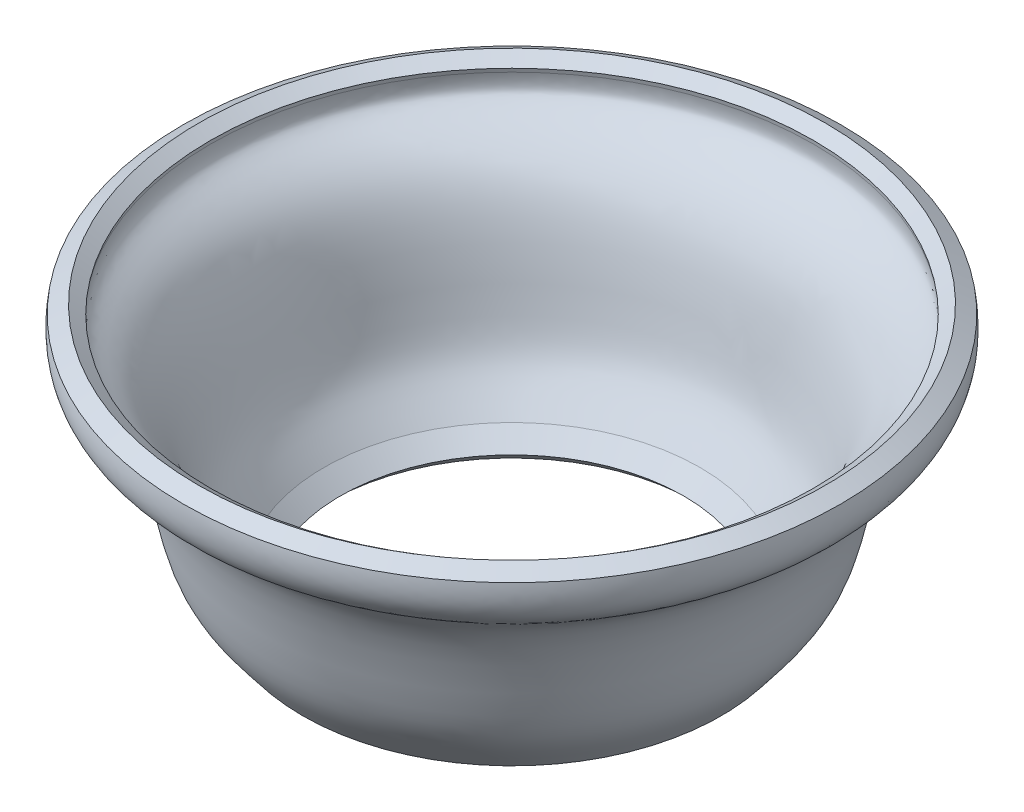
ISO-10303-21;
HEADER;
FILE_DESCRIPTION(('STEP AP214'),'2;1');
FILE_NAME('part.step','',(''),(''),'','','');
FILE_SCHEMA(('AUTOMOTIVE_DESIGN { 1 0 10303 214 1 1 1 1 }'));
ENDSEC;
DATA;
#1=APPLICATION_CONTEXT('core data for automotive mechanical design processes');
#2=APPLICATION_PROTOCOL_DEFINITION('international standard','automotive_design',2000,#1);
#3=PRODUCT_CONTEXT('',#1,'mechanical');
#4=PRODUCT('Part','Part','',(#3));
#5=PRODUCT_RELATED_PRODUCT_CATEGORY('part','',(#4));
#6=PRODUCT_DEFINITION_FORMATION('','',#4);
#7=PRODUCT_DEFINITION_CONTEXT('part definition',#1,'design');
#8=PRODUCT_DEFINITION('design','',#6,#7);
#9=PRODUCT_DEFINITION_SHAPE('','',#8);
#10=(LENGTH_UNIT() NAMED_UNIT(*) SI_UNIT(.MILLI.,.METRE.));
#11=(NAMED_UNIT(*) PLANE_ANGLE_UNIT() SI_UNIT($,.RADIAN.));
#12=(NAMED_UNIT(*) SI_UNIT($,.STERADIAN.) SOLID_ANGLE_UNIT());
#13=UNCERTAINTY_MEASURE_WITH_UNIT(LENGTH_MEASURE(1.E-05),#10,'distance_accuracy_value','');
#14=(GEOMETRIC_REPRESENTATION_CONTEXT(3) GLOBAL_UNCERTAINTY_ASSIGNED_CONTEXT((#13)) GLOBAL_UNIT_ASSIGNED_CONTEXT((#10,
#11,#12)) REPRESENTATION_CONTEXT('',''));
#15=CARTESIAN_POINT('',(0.,0.,0.));
#16=DIRECTION('',(0.,0.,1.));
#17=DIRECTION('',(1.,0.,0.));
#18=AXIS2_PLACEMENT_3D('',#15,#16,#17);
#19=CARTESIAN_POINT('',(77.9221141876927,25.4483814253624,0.));
#20=CARTESIAN_POINT('',(87.3940894819513,37.7299819321549,0.));
#21=CARTESIAN_POINT('',(92.1339969895028,41.8945842622561,0.));
#22=CARTESIAN_POINT('',(101.743341333837,99.7624551130541,0.));
#23=CARTESIAN_POINT('',(125.04695061557,97.4464920107877,0.));
#24=CARTESIAN_POINT('',(122.348179271715,115.917975982715,0.));
#25=B_SPLINE_CURVE_WITH_KNOTS('',3,(#19,#20,#21,#22,#23,#24),.UNSPECIFIED.,.F.,.F.,(4,1,1,4),
(0.,0.405601663420496,0.656925898222149,1.),.UNSPECIFIED.);
#26=CARTESIAN_POINT('',(0.,0.,0.));
#27=DIRECTION('',(0.,-1.,0.));
#28=AXIS1_PLACEMENT('',#26,#27);
#29=SURFACE_OF_REVOLUTION('',#25,#28);
#30=CARTESIAN_POINT('',(0.,115.917975982715,0.));
#31=DIRECTION('',(0.,-1.,0.));
#32=DIRECTION('',(0.,0.,-1.));
#33=AXIS2_PLACEMENT_3D('',#30,#31,#32);
#34=CIRCLE('',#33,122.348179271715);
#35=CARTESIAN_POINT('',(0.,115.917975982715,-122.348179271715));
#36=VERTEX_POINT('',#35);
#37=EDGE_CURVE('E10',#36,#36,#34,.T.);
#38=ORIENTED_EDGE('',*,*,#37,.T.);
#39=EDGE_LOOP('',(#38));
#40=FACE_BOUND('',#39,.T.);
#41=CARTESIAN_POINT('',(0.,25.4483814253624,0.));
#42=DIRECTION('',(0.,-1.,0.));
#43=DIRECTION('',(0.,0.,-1.));
#44=AXIS2_PLACEMENT_3D('',#41,#42,#43);
#45=CIRCLE('',#44,77.9221141876927);
#46=CARTESIAN_POINT('',(0.,25.4483814253624,-77.9221141876927));
#47=VERTEX_POINT('',#46);
#48=EDGE_CURVE('E75',#47,#47,#45,.T.);
#49=ORIENTED_EDGE('',*,*,#48,.F.);
#50=EDGE_LOOP('',(#49));
#51=FACE_BOUND('',#50,.T.);
#52=ADVANCED_FACE('F39',(#40,#51),#29,.F.);
#53=CARTESIAN_POINT('',(0.,115.917975982715,0.));
#54=DIRECTION('',(0.,-1.,0.));
#55=DIRECTION('',(0.,0.,-1.));
#56=AXIS2_PLACEMENT_3D('',#53,#54,#55);
#57=CONICAL_SURFACE('',#56,122.348179271715,1.04341288411621);
#58=CARTESIAN_POINT('',(0.,119.187259384567,0.));
#59=DIRECTION('',(0.,-1.,0.));
#60=DIRECTION('',(0.,0.,-1.));
#61=AXIS2_PLACEMENT_3D('',#58,#59,#60);
#62=CIRCLE('',#61,116.734784822938);
#63=CARTESIAN_POINT('',(0.,119.187259384567,-116.734784822938));
#64=VERTEX_POINT('',#63);
#65=EDGE_CURVE('E47',#64,#64,#62,.T.);
#66=ORIENTED_EDGE('',*,*,#65,.T.);
#67=EDGE_LOOP('',(#66));
#68=FACE_BOUND('',#67,.T.);
#69=ORIENTED_EDGE('',*,*,#37,.F.);
#70=EDGE_LOOP('',(#69));
#71=FACE_BOUND('',#70,.T.);
#72=ADVANCED_FACE('F102',(#68,#71),#57,.T.);
#73=CARTESIAN_POINT('',(0.,119.187259384567,0.));
#74=DIRECTION('',(0.,1.,0.));
#75=DIRECTION('',(0.,0.,1.));
#76=AXIS2_PLACEMENT_3D('',#73,#74,#75);
#77=CONICAL_SURFACE('',#76,116.734784822938,0.945821529777048);
#78=CARTESIAN_POINT('',(0.,115.917975982715,0.));
#79=DIRECTION('',(0.,-1.,0.));
#80=DIRECTION('',(0.,0.,-1.));
#81=AXIS2_PLACEMENT_3D('',#78,#79,#80);
#82=CIRCLE('',#81,112.203215086463);
#83=CARTESIAN_POINT('',(0.,115.917975982715,-112.203215086463));
#84=VERTEX_POINT('',#83);
#85=EDGE_CURVE('E52',#84,#84,#82,.T.);
#86=ORIENTED_EDGE('',*,*,#85,.T.);
#87=EDGE_LOOP('',(#86));
#88=FACE_BOUND('',#87,.T.);
#89=ORIENTED_EDGE('',*,*,#65,.F.);
#90=EDGE_LOOP('',(#89));
#91=FACE_BOUND('',#90,.T.);
#92=ADVANCED_FACE('F99',(#88,#91),#77,.F.);
#93=CARTESIAN_POINT('',(0.,115.917975982715,0.));
#94=DIRECTION('',(0.,-1.,0.));
#95=DIRECTION('',(0.,0.,-1.));
#96=AXIS2_PLACEMENT_3D('',#93,#94,#95);
#97=CONICAL_SURFACE('',#96,112.203215086463,0.171245586011219);
#98=CARTESIAN_POINT('',(0.,114.47227748403,0.));
#99=DIRECTION('',(0.,-1.,0.));
#100=DIRECTION('',(0.,0.,-1.));
#101=AXIS2_PLACEMENT_3D('',#98,#99,#100);
#102=CIRCLE('',#101,112.453233296577);
#103=CARTESIAN_POINT('',(0.,114.47227748403,-112.453233296577));
#104=VERTEX_POINT('',#103);
#105=EDGE_CURVE('E57',#104,#104,#102,.T.);
#106=ORIENTED_EDGE('',*,*,#105,.T.);
#107=EDGE_LOOP('',(#106));
#108=FACE_BOUND('',#107,.T.);
#109=ORIENTED_EDGE('',*,*,#85,.F.);
#110=EDGE_LOOP('',(#109));
#111=FACE_BOUND('',#110,.T.);
#112=ADVANCED_FACE('F94',(#108,#111),#97,.F.);
#113=CARTESIAN_POINT('',(112.453233296577,114.47227748403,0.));
#114=CARTESIAN_POINT('',(112.497046512243,114.172402093408,0.));
#115=CARTESIAN_POINT('',(112.577768508592,113.54932973421,0.));
#116=CARTESIAN_POINT('',(112.678172061883,112.473726316707,0.));
#117=CARTESIAN_POINT('',(112.717650257948,111.323879625534,0.));
#118=CARTESIAN_POINT('',(112.661531964546,110.276388939014,0.));
#119=CARTESIAN_POINT('',(112.505121694198,109.262598865516,0.));
#120=CARTESIAN_POINT('',(112.263921299084,108.590233313085,0.));
#121=CARTESIAN_POINT('',(111.959441744317,108.064826198113,0.));
#122=CARTESIAN_POINT('',(111.289429579775,107.288159566067,0.));
#123=CARTESIAN_POINT('',(109.949238506969,106.157684220077,0.));
#124=CARTESIAN_POINT('',(107.901118573501,104.703722943208,0.));
#125=CARTESIAN_POINT('',(105.25177637214,102.882515679422,0.));
#126=CARTESIAN_POINT('',(102.167669155592,100.558410453743,0.));
#127=CARTESIAN_POINT('',(99.4185016618685,98.0384699963057,0.));
#128=CARTESIAN_POINT('',(97.2702097147581,95.6048269092689,0.));
#129=CARTESIAN_POINT('',(95.7097800265984,93.5355684130829,0.));
#130=CARTESIAN_POINT('',(94.3135368474947,91.3317697875323,0.));
#131=CARTESIAN_POINT('',(92.6911627646633,88.3458202726958,0.));
#132=CARTESIAN_POINT('',(90.9981240052986,84.4975556270147,0.));
#133=CARTESIAN_POINT('',(88.7957487403077,78.2035378026221,0.));
#134=CARTESIAN_POINT('',(87.1404446909139,71.8429060253683,0.));
#135=CARTESIAN_POINT('',(85.7951148545497,65.8464575934233,0.));
#136=CARTESIAN_POINT('',(84.9036513113898,61.6625519374478,0.));
#137=CARTESIAN_POINT('',(84.1027455017783,57.968162818229,0.));
#138=CARTESIAN_POINT('',(83.1127765862658,53.8426383977567,0.));
#139=CARTESIAN_POINT('',(81.9429813560959,49.846759754146,0.));
#140=CARTESIAN_POINT('',(80.5958406584344,46.4828266651874,0.));
#141=CARTESIAN_POINT('',(79.3620539644298,44.1882944387591,0.));
#142=CARTESIAN_POINT('',(78.0985803432021,42.2192740530324,0.));
#143=CARTESIAN_POINT('',(76.9619583054438,40.5986696771371,0.));
#144=CARTESIAN_POINT('',(75.6021133375992,38.7727422091658,0.));
#145=CARTESIAN_POINT('',(74.002744681414,36.6975557321779,0.));
#146=CARTESIAN_POINT('',(72.4568713068047,34.7169187483684,0.));
#147=CARTESIAN_POINT('',(71.1044190779229,32.9791646262186,0.));
#148=CARTESIAN_POINT('',(70.364419911247,32.0233674419788,0.));
#149=CARTESIAN_POINT('',(70.0035426336066,31.5554449212513,0.));
#150=B_SPLINE_CURVE_WITH_KNOTS('',3,(#113,#114,#115,#116,#117,#118,#119,#120,#121,#122,#123,
#124,#125,#126,#127,#128,#129,#130,#131,#132,#133,#134,#135,#136,#137,#138,#139,#140,#141,#142,
#143,#144,#145,#146,#147,#148,#149),.UNSPECIFIED.,.F.,.F.,(4,1,1,1,1,1,1,1,1,1,1,1,1,1,1,1,1,1,
1,1,1,1,1,1,1,1,1,1,1,1,1,1,1,1,4),(0.,0.0078125,0.015625,0.03125,0.046875,0.0625,0.09375,0.125,
0.15625,0.1875,0.21875,0.25,0.28125,0.3125,0.328125,0.34375,0.359375,0.375,0.40625,0.4375,0.5,
0.53125,0.5625,0.59375,0.625,0.6875,0.75,0.8125,0.84375,0.875,0.90625,0.9375,0.96875,0.984375,
1.),.UNSPECIFIED.);
#151=CARTESIAN_POINT('',(0.,0.,0.));
#152=DIRECTION('',(0.,-1.,0.));
#153=AXIS1_PLACEMENT('',#151,#152);
#154=SURFACE_OF_REVOLUTION('',#150,#153);
#155=CARTESIAN_POINT('',(0.,31.5554449212513,0.));
#156=DIRECTION('',(0.,-1.,0.));
#157=DIRECTION('',(0.,0.,-1.));
#158=AXIS2_PLACEMENT_3D('',#155,#156,#157);
#159=CIRCLE('',#158,70.0035426336066);
#160=CARTESIAN_POINT('',(0.,31.5554449212513,-70.0035426336066));
#161=VERTEX_POINT('',#160);
#162=EDGE_CURVE('E63',#161,#161,#159,.T.);
#163=ORIENTED_EDGE('',*,*,#162,.T.);
#164=EDGE_LOOP('',(#163));
#165=FACE_BOUND('',#164,.T.);
#166=ORIENTED_EDGE('',*,*,#105,.F.);
#167=EDGE_LOOP('',(#166));
#168=FACE_BOUND('',#167,.T.);
#169=ADVANCED_FACE('F89',(#165,#168),#154,.F.);
#170=CARTESIAN_POINT('',(0.,31.5554449212513,0.));
#171=DIRECTION('',(0.,1.,0.));
#172=DIRECTION('',(0.,0.,1.));
#173=AXIS2_PLACEMENT_3D('',#170,#171,#172);
#174=CONICAL_SURFACE('',#173,70.0035426336066,0.785398163397439);
#175=CARTESIAN_POINT('',(0.,25.4483814253624,0.));
#176=DIRECTION('',(0.,-1.,0.));
#177=DIRECTION('',(0.,0.,-1.));
#178=AXIS2_PLACEMENT_3D('',#175,#176,#177);
#179=CIRCLE('',#178,63.8964791377179);
#180=CARTESIAN_POINT('',(0.,25.4483814253624,-63.8964791377179));
#181=VERTEX_POINT('',#180);
#182=EDGE_CURVE('E67',#181,#181,#179,.T.);
#183=ORIENTED_EDGE('',*,*,#182,.T.);
#184=EDGE_LOOP('',(#183));
#185=FACE_BOUND('',#184,.T.);
#186=ORIENTED_EDGE('',*,*,#162,.F.);
#187=EDGE_LOOP('',(#186));
#188=FACE_BOUND('',#187,.T.);
#189=ADVANCED_FACE('F93',(#185,#188),#174,.F.);
#190=CARTESIAN_POINT('',(0.,25.4483814253624,0.));
#191=DIRECTION('',(0.,-1.,0.));
#192=DIRECTION('',(0.,0.,-1.));
#193=AXIS2_PLACEMENT_3D('',#190,#191,#192);
#194=CONICAL_SURFACE('',#193,63.8964791377179,0.816451509300948);
#195=CARTESIAN_POINT('',(0.,21.26652748862,0.));
#196=DIRECTION('',(0.,-1.,0.));
#197=DIRECTION('',(0.,0.,-1.));
#198=AXIS2_PLACEMENT_3D('',#195,#196,#197);
#199=CIRCLE('',#198,68.3464668320015);
#200=CARTESIAN_POINT('',(0.,21.26652748862,-68.3464668320015));
#201=VERTEX_POINT('',#200);
#202=EDGE_CURVE('E71',#201,#201,#199,.T.);
#203=ORIENTED_EDGE('',*,*,#202,.T.);
#204=EDGE_LOOP('',(#203));
#205=FACE_BOUND('',#204,.T.);
#206=ORIENTED_EDGE('',*,*,#182,.F.);
#207=EDGE_LOOP('',(#206));
#208=FACE_BOUND('',#207,.T.);
#209=ADVANCED_FACE('F117',(#205,#208),#194,.F.);
#210=CARTESIAN_POINT('',(0.,21.26652748862,0.));
#211=DIRECTION('',(0.,1.,0.));
#212=DIRECTION('',(0.,0.,1.));
#213=AXIS2_PLACEMENT_3D('',#210,#211,#212);
#214=CONICAL_SURFACE('',#213,68.3464668320015,1.15904275879397);
#215=ORIENTED_EDGE('',*,*,#48,.T.);
#216=EDGE_LOOP('',(#215));
#217=FACE_BOUND('',#216,.T.);
#218=ORIENTED_EDGE('',*,*,#202,.F.);
#219=EDGE_LOOP('',(#218));
#220=FACE_BOUND('',#219,.T.);
#221=ADVANCED_FACE('F114',(#217,#220),#214,.T.);
#222=CLOSED_SHELL('',(#52,#72,#92,#112,#169,#189,#209,#221));
#223=MANIFOLD_SOLID_BREP('B2',#222);
#224=ADVANCED_BREP_SHAPE_REPRESENTATION('',(#18,#223),#14);
#225=SHAPE_DEFINITION_REPRESENTATION(#9,#224);
ENDSEC;
END-ISO-10303-21;
